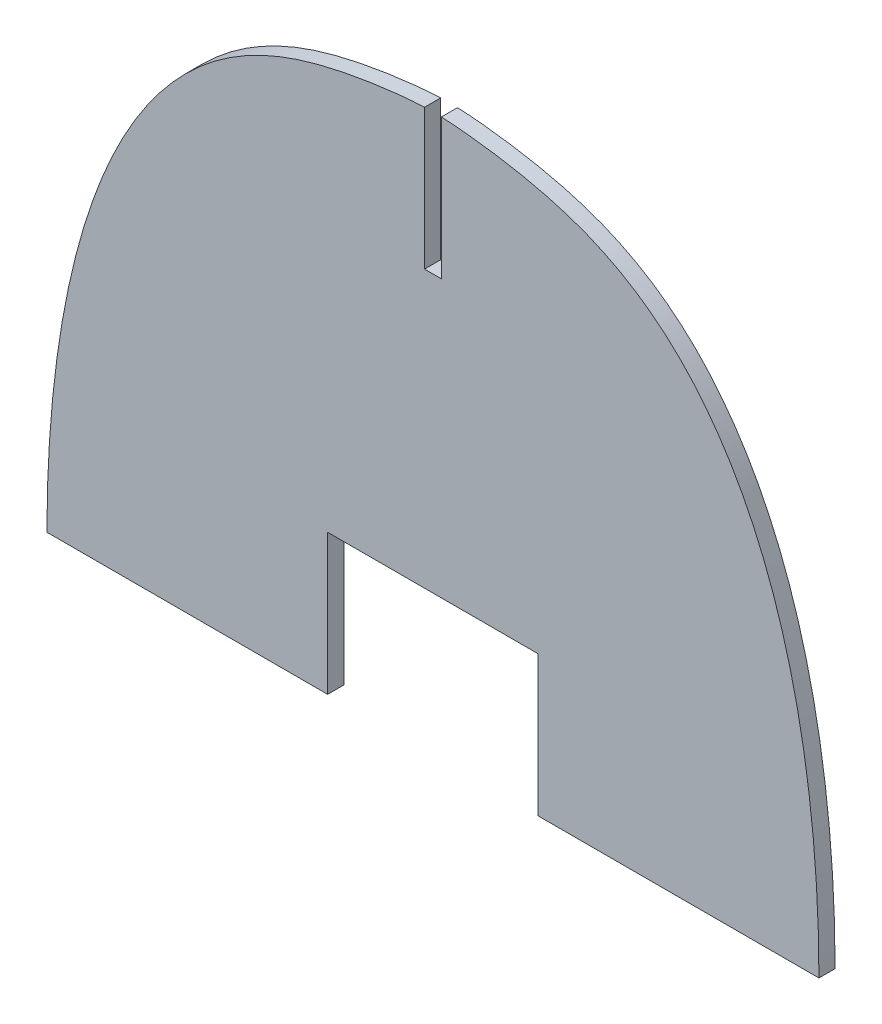
ISO-10303-21;
HEADER;
FILE_DESCRIPTION(('STEP AP214'),'2;1');
FILE_NAME('part.step','',(''),(''),'','','');
FILE_SCHEMA(('AUTOMOTIVE_DESIGN { 1 0 10303 214 1 1 1 1 }'));
ENDSEC;
DATA;
#1=APPLICATION_CONTEXT('core data for automotive mechanical design processes');
#2=APPLICATION_PROTOCOL_DEFINITION('international standard','automotive_design',2000,#1);
#3=PRODUCT_CONTEXT('',#1,'mechanical');
#4=PRODUCT('Part','Part','',(#3));
#5=PRODUCT_RELATED_PRODUCT_CATEGORY('part','',(#4));
#6=PRODUCT_DEFINITION_FORMATION('','',#4);
#7=PRODUCT_DEFINITION_CONTEXT('part definition',#1,'design');
#8=PRODUCT_DEFINITION('design','',#6,#7);
#9=PRODUCT_DEFINITION_SHAPE('','',#8);
#10=(LENGTH_UNIT() NAMED_UNIT(*) SI_UNIT(.MILLI.,.METRE.));
#11=(NAMED_UNIT(*) PLANE_ANGLE_UNIT() SI_UNIT($,.RADIAN.));
#12=(NAMED_UNIT(*) SI_UNIT($,.STERADIAN.) SOLID_ANGLE_UNIT());
#13=UNCERTAINTY_MEASURE_WITH_UNIT(LENGTH_MEASURE(1.E-05),#10,'distance_accuracy_value','');
#14=(GEOMETRIC_REPRESENTATION_CONTEXT(3) GLOBAL_UNCERTAINTY_ASSIGNED_CONTEXT((#13)) GLOBAL_UNIT_ASSIGNED_CONTEXT((#10,
#11,#12)) REPRESENTATION_CONTEXT('',''));
#15=CARTESIAN_POINT('',(0.,0.,0.));
#16=DIRECTION('',(0.,0.,1.));
#17=DIRECTION('',(1.,0.,0.));
#18=AXIS2_PLACEMENT_3D('',#15,#16,#17);
#19=CARTESIAN_POINT('',(139.7,39.6875,5.842));
#20=CARTESIAN_POINT('',(139.7,89.9228431181553,5.842));
#21=CARTESIAN_POINT('',(128.782940081461,181.905443126039,5.842));
#22=CARTESIAN_POINT('',(56.6568904081966,236.359137647625,5.842));
#23=CARTESIAN_POINT('',(9.00818653195615,241.3,5.842));
#24=CARTESIAN_POINT('',(0.,241.3,5.842));
#25=B_SPLINE_CURVE_WITH_KNOTS('',3,(#19,#20,#21,#22,#23,#24),.UNSPECIFIED.,.F.,.F.,(4,1,1,4),
(0.,0.609698105068244,0.823727725190515,1.),.UNSPECIFIED.);
#26=DIRECTION('',(0.,0.,-1.));
#27=VECTOR('',#26,1.);
#28=SURFACE_OF_LINEAR_EXTRUSION('',#25,#27);
#29=CARTESIAN_POINT('',(139.7,39.6875,0.));
#30=CARTESIAN_POINT('',(139.7,89.9228431181553,0.));
#31=CARTESIAN_POINT('',(128.782940081461,181.905443126039,0.));
#32=CARTESIAN_POINT('',(56.6568904081966,236.359137647625,0.));
#33=CARTESIAN_POINT('',(9.00818653195615,241.3,0.));
#34=CARTESIAN_POINT('',(0.,241.3,0.));
#35=B_SPLINE_CURVE_WITH_KNOTS('',3,(#29,#30,#31,#32,#33,#34),.UNSPECIFIED.,.F.,.F.,(4,1,1,4),
(0.,0.609698105068244,0.823727725190515,1.),.UNSPECIFIED.);
#36=CARTESIAN_POINT('',(139.7,39.6875,0.));
#37=VERTEX_POINT('',#36);
#38=CARTESIAN_POINT('',(3.048,241.232496396372,0.));
#39=VERTEX_POINT('',#38);
#40=EDGE_CURVE('E210',#37,#39,#35,.T.);
#41=ORIENTED_EDGE('',*,*,#40,.T.);
#42=DIRECTION('',(0.,0.,-1.));
#43=VECTOR('',#42,1.);
#44=CARTESIAN_POINT('',(3.048,241.232496396372,5.842));
#45=LINE('',#44,#43);
#46=CARTESIAN_POINT('',(3.048,241.232496396372,5.842));
#47=VERTEX_POINT('',#46);
#48=EDGE_CURVE('E223',#39,#47,#45,.F.);
#49=ORIENTED_EDGE('',*,*,#48,.T.);
#50=CARTESIAN_POINT('',(139.7,39.6875,5.842));
#51=VERTEX_POINT('',#50);
#52=EDGE_CURVE('E202',#51,#47,#25,.T.);
#53=ORIENTED_EDGE('',*,*,#52,.F.);
#54=DIRECTION('',(0.,0.,-1.));
#55=VECTOR('',#54,1.);
#56=CARTESIAN_POINT('',(139.7,39.6875,5.842));
#57=LINE('',#56,#55);
#58=EDGE_CURVE('E11',#51,#37,#57,.T.);
#59=ORIENTED_EDGE('',*,*,#58,.T.);
#60=EDGE_LOOP('',(#41,#49,#53,#59));
#61=FACE_BOUND('',#60,.T.);
#62=ADVANCED_FACE('F33',(#61),#28,.F.);
#63=CARTESIAN_POINT('',(139.7,39.6875,5.842));
#64=DIRECTION('',(0.,1.,0.));
#65=DIRECTION('',(-1.,0.,0.));
#66=AXIS2_PLACEMENT_3D('',#63,#64,#65);
#67=PLANE('',#66);
#68=DIRECTION('',(1.,0.,0.));
#69=VECTOR('',#68,1.);
#70=CARTESIAN_POINT('',(139.7,39.6875,5.842));
#71=LINE('',#70,#69);
#72=CARTESIAN_POINT('',(38.1,39.6875,5.842));
#73=VERTEX_POINT('',#72);
#74=EDGE_CURVE('E41',#73,#51,#71,.T.);
#75=ORIENTED_EDGE('',*,*,#74,.F.);
#76=DIRECTION('',(0.,0.,1.));
#77=VECTOR('',#76,1.);
#78=CARTESIAN_POINT('',(38.1,39.6875,0.));
#79=LINE('',#78,#77);
#80=CARTESIAN_POINT('',(38.1,39.6875,0.));
#81=VERTEX_POINT('',#80);
#82=EDGE_CURVE('E198',#81,#73,#79,.T.);
#83=ORIENTED_EDGE('',*,*,#82,.F.);
#84=DIRECTION('',(1.,0.,0.));
#85=VECTOR('',#84,1.);
#86=CARTESIAN_POINT('',(139.7,39.6875,0.));
#87=LINE('',#86,#85);
#88=EDGE_CURVE('E204',#81,#37,#87,.T.);
#89=ORIENTED_EDGE('',*,*,#88,.T.);
#90=ORIENTED_EDGE('',*,*,#58,.F.);
#91=EDGE_LOOP('',(#75,#83,#89,#90));
#92=FACE_BOUND('',#91,.T.);
#93=ADVANCED_FACE('F186',(#92),#67,.F.);
#94=CARTESIAN_POINT('',(113.200562465662,175.203713259518,5.842));
#95=DIRECTION('',(0.,0.,1.));
#96=DIRECTION('',(1.,0.,0.));
#97=AXIS2_PLACEMENT_3D('',#94,#95,#96);
#98=PLANE('',#97);
#99=DIRECTION('',(0.,1.,0.));
#100=VECTOR('',#99,1.);
#101=CARTESIAN_POINT('',(3.048,241.3,5.842));
#102=LINE('',#101,#100);
#103=CARTESIAN_POINT('',(3.04800000000001,190.5,5.842));
#104=VERTEX_POINT('',#103);
#105=EDGE_CURVE('E118',#104,#47,#102,.T.);
#106=ORIENTED_EDGE('',*,*,#105,.F.);
#107=DIRECTION('',(1.,0.,0.));
#108=VECTOR('',#107,1.);
#109=CARTESIAN_POINT('',(0.,190.5,5.842));
#110=LINE('',#109,#108);
#111=CARTESIAN_POINT('',(-3.04800000000001,190.5,5.842));
#112=VERTEX_POINT('',#111);
#113=EDGE_CURVE('E110',#112,#104,#110,.T.);
#114=ORIENTED_EDGE('',*,*,#113,.F.);
#115=DIRECTION('',(0.,1.,0.));
#116=VECTOR('',#115,1.);
#117=CARTESIAN_POINT('',(-3.048,241.3,5.842));
#118=LINE('',#117,#116);
#119=CARTESIAN_POINT('',(-3.048,241.232496396372,5.842));
#120=VERTEX_POINT('',#119);
#121=EDGE_CURVE('E115',#112,#120,#118,.T.);
#122=ORIENTED_EDGE('',*,*,#121,.T.);
#123=CARTESIAN_POINT('',(-139.7,39.6875,5.842));
#124=CARTESIAN_POINT('',(-139.7,89.9228431181553,5.842));
#125=CARTESIAN_POINT('',(-128.782940081461,181.905443126039,5.842));
#126=CARTESIAN_POINT('',(-56.6568904081966,236.359137647625,5.842));
#127=CARTESIAN_POINT('',(-9.00818653195615,241.3,5.842));
#128=CARTESIAN_POINT('',(0.,241.3,5.842));
#129=B_SPLINE_CURVE_WITH_KNOTS('',3,(#123,#124,#125,#126,#127,#128),.UNSPECIFIED.,.F.,.F.,(4,1,
1,4),(0.,0.609698105068244,0.823727725190515,1.),.UNSPECIFIED.);
#130=CARTESIAN_POINT('',(-139.7,39.6875,5.842));
#131=VERTEX_POINT('',#130);
#132=EDGE_CURVE('E152',#131,#120,#129,.T.);
#133=ORIENTED_EDGE('',*,*,#132,.F.);
#134=DIRECTION('',(-1.,0.,0.));
#135=VECTOR('',#134,1.);
#136=CARTESIAN_POINT('',(-139.7,39.6875,5.842));
#137=LINE('',#136,#135);
#138=CARTESIAN_POINT('',(-38.1,39.6875,5.842));
#139=VERTEX_POINT('',#138);
#140=EDGE_CURVE('E157',#139,#131,#137,.T.);
#141=ORIENTED_EDGE('',*,*,#140,.F.);
#142=DIRECTION('',(0.,1.,0.));
#143=VECTOR('',#142,1.);
#144=CARTESIAN_POINT('',(-38.1,39.6875,5.842));
#145=LINE('',#144,#143);
#146=CARTESIAN_POINT('',(-38.1,90.4875,5.842));
#147=VERTEX_POINT('',#146);
#148=EDGE_CURVE('E139',#139,#147,#145,.T.);
#149=ORIENTED_EDGE('',*,*,#148,.T.);
#150=DIRECTION('',(-1.,0.,0.));
#151=VECTOR('',#150,1.);
#152=CARTESIAN_POINT('',(0.,90.4875,5.842));
#153=LINE('',#152,#151);
#154=CARTESIAN_POINT('',(38.1,90.4875,5.842));
#155=VERTEX_POINT('',#154);
#156=EDGE_CURVE('E233',#155,#147,#153,.T.);
#157=ORIENTED_EDGE('',*,*,#156,.F.);
#158=DIRECTION('',(0.,1.,0.));
#159=VECTOR('',#158,1.);
#160=CARTESIAN_POINT('',(38.1,39.6875,5.842));
#161=LINE('',#160,#159);
#162=EDGE_CURVE('E230',#73,#155,#161,.T.);
#163=ORIENTED_EDGE('',*,*,#162,.F.);
#164=ORIENTED_EDGE('',*,*,#74,.T.);
#165=ORIENTED_EDGE('',*,*,#52,.T.);
#166=EDGE_LOOP('',(#106,#114,#122,#133,#141,#149,#157,#163,#164,#165));
#167=FACE_BOUND('',#166,.T.);
#168=ADVANCED_FACE('F112',(#167),#98,.T.);
#169=CARTESIAN_POINT('',(113.200562465662,175.203713259518,0.));
#170=DIRECTION('',(0.,0.,1.));
#171=DIRECTION('',(1.,0.,0.));
#172=AXIS2_PLACEMENT_3D('',#169,#170,#171);
#173=PLANE('',#172);
#174=DIRECTION('',(1.,0.,0.));
#175=VECTOR('',#174,1.);
#176=CARTESIAN_POINT('',(0.,190.5,0.));
#177=LINE('',#176,#175);
#178=CARTESIAN_POINT('',(-3.04800000000001,190.5,0.));
#179=VERTEX_POINT('',#178);
#180=CARTESIAN_POINT('',(3.04800000000001,190.5,0.));
#181=VERTEX_POINT('',#180);
#182=EDGE_CURVE('E126',#179,#181,#177,.T.);
#183=ORIENTED_EDGE('',*,*,#182,.T.);
#184=DIRECTION('',(0.,1.,0.));
#185=VECTOR('',#184,1.);
#186=CARTESIAN_POINT('',(3.048,241.3,0.));
#187=LINE('',#186,#185);
#188=EDGE_CURVE('E48',#181,#39,#187,.T.);
#189=ORIENTED_EDGE('',*,*,#188,.T.);
#190=ORIENTED_EDGE('',*,*,#40,.F.);
#191=ORIENTED_EDGE('',*,*,#88,.F.);
#192=DIRECTION('',(0.,1.,0.));
#193=VECTOR('',#192,1.);
#194=CARTESIAN_POINT('',(38.1,39.6875,0.));
#195=LINE('',#194,#193);
#196=CARTESIAN_POINT('',(38.1,90.4875,0.));
#197=VERTEX_POINT('',#196);
#198=EDGE_CURVE('E231',#81,#197,#195,.T.);
#199=ORIENTED_EDGE('',*,*,#198,.T.);
#200=DIRECTION('',(-1.,0.,0.));
#201=VECTOR('',#200,1.);
#202=CARTESIAN_POINT('',(0.,90.4875,0.));
#203=LINE('',#202,#201);
#204=CARTESIAN_POINT('',(-38.1,90.4875,0.));
#205=VERTEX_POINT('',#204);
#206=EDGE_CURVE('E56',#197,#205,#203,.T.);
#207=ORIENTED_EDGE('',*,*,#206,.T.);
#208=DIRECTION('',(0.,1.,0.));
#209=VECTOR('',#208,1.);
#210=CARTESIAN_POINT('',(-38.1,39.6875,0.));
#211=LINE('',#210,#209);
#212=CARTESIAN_POINT('',(-38.1,39.6875,0.));
#213=VERTEX_POINT('',#212);
#214=EDGE_CURVE('E140',#213,#205,#211,.T.);
#215=ORIENTED_EDGE('',*,*,#214,.F.);
#216=DIRECTION('',(-1.,0.,0.));
#217=VECTOR('',#216,1.);
#218=CARTESIAN_POINT('',(-139.7,39.6875,0.));
#219=LINE('',#218,#217);
#220=CARTESIAN_POINT('',(-139.7,39.6875,0.));
#221=VERTEX_POINT('',#220);
#222=EDGE_CURVE('E158',#213,#221,#219,.T.);
#223=ORIENTED_EDGE('',*,*,#222,.T.);
#224=CARTESIAN_POINT('',(-139.7,39.6875,0.));
#225=CARTESIAN_POINT('',(-139.7,89.9228431181553,0.));
#226=CARTESIAN_POINT('',(-128.782940081461,181.905443126039,0.));
#227=CARTESIAN_POINT('',(-56.6568904081966,236.359137647625,0.));
#228=CARTESIAN_POINT('',(-9.00818653195615,241.3,0.));
#229=CARTESIAN_POINT('',(0.,241.3,0.));
#230=B_SPLINE_CURVE_WITH_KNOTS('',3,(#224,#225,#226,#227,#228,#229),.UNSPECIFIED.,.F.,.F.,(4,1,
1,4),(0.,0.609698105068244,0.823727725190515,1.),.UNSPECIFIED.);
#231=CARTESIAN_POINT('',(-3.048,241.232496396372,0.));
#232=VERTEX_POINT('',#231);
#233=EDGE_CURVE('E149',#221,#232,#230,.T.);
#234=ORIENTED_EDGE('',*,*,#233,.T.);
#235=DIRECTION('',(0.,1.,0.));
#236=VECTOR('',#235,1.);
#237=CARTESIAN_POINT('',(-3.048,241.3,0.));
#238=LINE('',#237,#236);
#239=EDGE_CURVE('E130',#179,#232,#238,.T.);
#240=ORIENTED_EDGE('',*,*,#239,.F.);
#241=EDGE_LOOP('',(#183,#189,#190,#191,#199,#207,#215,#223,#234,#240));
#242=FACE_BOUND('',#241,.T.);
#243=ADVANCED_FACE('F180',(#242),#173,.F.);
#244=CARTESIAN_POINT('',(0.,90.4875,0.));
#245=DIRECTION('',(0.,1.,0.));
#246=DIRECTION('',(0.,0.,1.));
#247=AXIS2_PLACEMENT_3D('',#244,#245,#246);
#248=PLANE('',#247);
#249=ORIENTED_EDGE('',*,*,#156,.T.);
#250=DIRECTION('',(0.,0.,1.));
#251=VECTOR('',#250,1.);
#252=CARTESIAN_POINT('',(-38.1,90.4875,0.));
#253=LINE('',#252,#251);
#254=EDGE_CURVE('E146',#205,#147,#253,.T.);
#255=ORIENTED_EDGE('',*,*,#254,.F.);
#256=ORIENTED_EDGE('',*,*,#206,.F.);
#257=DIRECTION('',(0.,0.,1.));
#258=VECTOR('',#257,1.);
#259=CARTESIAN_POINT('',(38.1,90.4875,0.));
#260=LINE('',#259,#258);
#261=EDGE_CURVE('E214',#197,#155,#260,.T.);
#262=ORIENTED_EDGE('',*,*,#261,.T.);
#263=EDGE_LOOP('',(#249,#255,#256,#262));
#264=FACE_BOUND('',#263,.T.);
#265=ADVANCED_FACE('F177',(#264),#248,.F.);
#266=CARTESIAN_POINT('',(38.1,39.6875,0.));
#267=DIRECTION('',(1.,0.,0.));
#268=DIRECTION('',(0.,0.,-1.));
#269=AXIS2_PLACEMENT_3D('',#266,#267,#268);
#270=PLANE('',#269);
#271=ORIENTED_EDGE('',*,*,#162,.T.);
#272=ORIENTED_EDGE('',*,*,#261,.F.);
#273=ORIENTED_EDGE('',*,*,#198,.F.);
#274=ORIENTED_EDGE('',*,*,#82,.T.);
#275=EDGE_LOOP('',(#271,#272,#273,#274));
#276=FACE_BOUND('',#275,.T.);
#277=ADVANCED_FACE('F174',(#276),#270,.F.);
#278=CARTESIAN_POINT('',(3.048,241.3,0.));
#279=DIRECTION('',(1.,0.,0.));
#280=DIRECTION('',(0.,1.,0.));
#281=AXIS2_PLACEMENT_3D('',#278,#279,#280);
#282=PLANE('',#281);
#283=ORIENTED_EDGE('',*,*,#188,.F.);
#284=DIRECTION('',(0.,0.,1.));
#285=VECTOR('',#284,1.);
#286=CARTESIAN_POINT('',(3.04800000000001,190.5,0.));
#287=LINE('',#286,#285);
#288=EDGE_CURVE('E221',#181,#104,#287,.T.);
#289=ORIENTED_EDGE('',*,*,#288,.T.);
#290=ORIENTED_EDGE('',*,*,#105,.T.);
#291=ORIENTED_EDGE('',*,*,#48,.F.);
#292=EDGE_LOOP('',(#283,#289,#290,#291));
#293=FACE_BOUND('',#292,.T.);
#294=ADVANCED_FACE('F171',(#293),#282,.F.);
#295=CARTESIAN_POINT('',(0.,190.5,0.));
#296=DIRECTION('',(0.,-1.,0.));
#297=DIRECTION('',(0.,0.,-1.));
#298=AXIS2_PLACEMENT_3D('',#295,#296,#297);
#299=PLANE('',#298);
#300=ORIENTED_EDGE('',*,*,#113,.T.);
#301=ORIENTED_EDGE('',*,*,#288,.F.);
#302=ORIENTED_EDGE('',*,*,#182,.F.);
#303=DIRECTION('',(0.,0.,1.));
#304=VECTOR('',#303,1.);
#305=CARTESIAN_POINT('',(-3.04800000000001,190.5,0.));
#306=LINE('',#305,#304);
#307=EDGE_CURVE('E123',#179,#112,#306,.T.);
#308=ORIENTED_EDGE('',*,*,#307,.T.);
#309=EDGE_LOOP('',(#300,#301,#302,#308));
#310=FACE_BOUND('',#309,.T.);
#311=ADVANCED_FACE('F124',(#310),#299,.F.);
#312=DIRECTION('',(0.,0.,-1.));
#313=VECTOR('',#312,1.);
#314=SURFACE_OF_LINEAR_EXTRUSION('',#129,#313);
#315=ORIENTED_EDGE('',*,*,#233,.F.);
#316=DIRECTION('',(0.,0.,-1.));
#317=VECTOR('',#316,1.);
#318=CARTESIAN_POINT('',(-139.7,39.6875,5.842));
#319=LINE('',#318,#317);
#320=EDGE_CURVE('E120',#131,#221,#319,.T.);
#321=ORIENTED_EDGE('',*,*,#320,.F.);
#322=ORIENTED_EDGE('',*,*,#132,.T.);
#323=DIRECTION('',(0.,0.,-1.));
#324=VECTOR('',#323,1.);
#325=CARTESIAN_POINT('',(-3.048,241.232496396372,5.842));
#326=LINE('',#325,#324);
#327=EDGE_CURVE('E129',#232,#120,#326,.F.);
#328=ORIENTED_EDGE('',*,*,#327,.F.);
#329=EDGE_LOOP('',(#315,#321,#322,#328));
#330=FACE_BOUND('',#329,.T.);
#331=ADVANCED_FACE('F164',(#330),#314,.T.);
#332=CARTESIAN_POINT('',(-139.7,39.6875,5.842));
#333=DIRECTION('',(0.,1.,0.));
#334=DIRECTION('',(1.,0.,0.));
#335=AXIS2_PLACEMENT_3D('',#332,#333,#334);
#336=PLANE('',#335);
#337=ORIENTED_EDGE('',*,*,#140,.T.);
#338=ORIENTED_EDGE('',*,*,#320,.T.);
#339=ORIENTED_EDGE('',*,*,#222,.F.);
#340=DIRECTION('',(0.,0.,1.));
#341=VECTOR('',#340,1.);
#342=CARTESIAN_POINT('',(-38.1,39.6875,0.));
#343=LINE('',#342,#341);
#344=EDGE_CURVE('E143',#213,#139,#343,.T.);
#345=ORIENTED_EDGE('',*,*,#344,.T.);
#346=EDGE_LOOP('',(#337,#338,#339,#345));
#347=FACE_BOUND('',#346,.T.);
#348=ADVANCED_FACE('F168',(#347),#336,.F.);
#349=CARTESIAN_POINT('',(-38.1,39.6875,0.));
#350=DIRECTION('',(-1.,0.,0.));
#351=DIRECTION('',(0.,0.,-1.));
#352=AXIS2_PLACEMENT_3D('',#349,#350,#351);
#353=PLANE('',#352);
#354=ORIENTED_EDGE('',*,*,#148,.F.);
#355=ORIENTED_EDGE('',*,*,#344,.F.);
#356=ORIENTED_EDGE('',*,*,#214,.T.);
#357=ORIENTED_EDGE('',*,*,#254,.T.);
#358=EDGE_LOOP('',(#354,#355,#356,#357));
#359=FACE_BOUND('',#358,.T.);
#360=ADVANCED_FACE('F241',(#359),#353,.F.);
#361=CARTESIAN_POINT('',(-3.048,241.3,0.));
#362=DIRECTION('',(-1.,0.,0.));
#363=DIRECTION('',(0.,1.,0.));
#364=AXIS2_PLACEMENT_3D('',#361,#362,#363);
#365=PLANE('',#364);
#366=ORIENTED_EDGE('',*,*,#239,.T.);
#367=ORIENTED_EDGE('',*,*,#327,.T.);
#368=ORIENTED_EDGE('',*,*,#121,.F.);
#369=ORIENTED_EDGE('',*,*,#307,.F.);
#370=EDGE_LOOP('',(#366,#367,#368,#369));
#371=FACE_BOUND('',#370,.T.);
#372=ADVANCED_FACE('F132',(#371),#365,.F.);
#373=CLOSED_SHELL('',(#62,#93,#168,#243,#265,#277,#294,#311,#331,#348,#360,#372));
#374=MANIFOLD_SOLID_BREP('B2',#373);
#375=ADVANCED_BREP_SHAPE_REPRESENTATION('',(#18,#374),#14);
#376=SHAPE_DEFINITION_REPRESENTATION(#9,#375);
ENDSEC;
END-ISO-10303-21;
